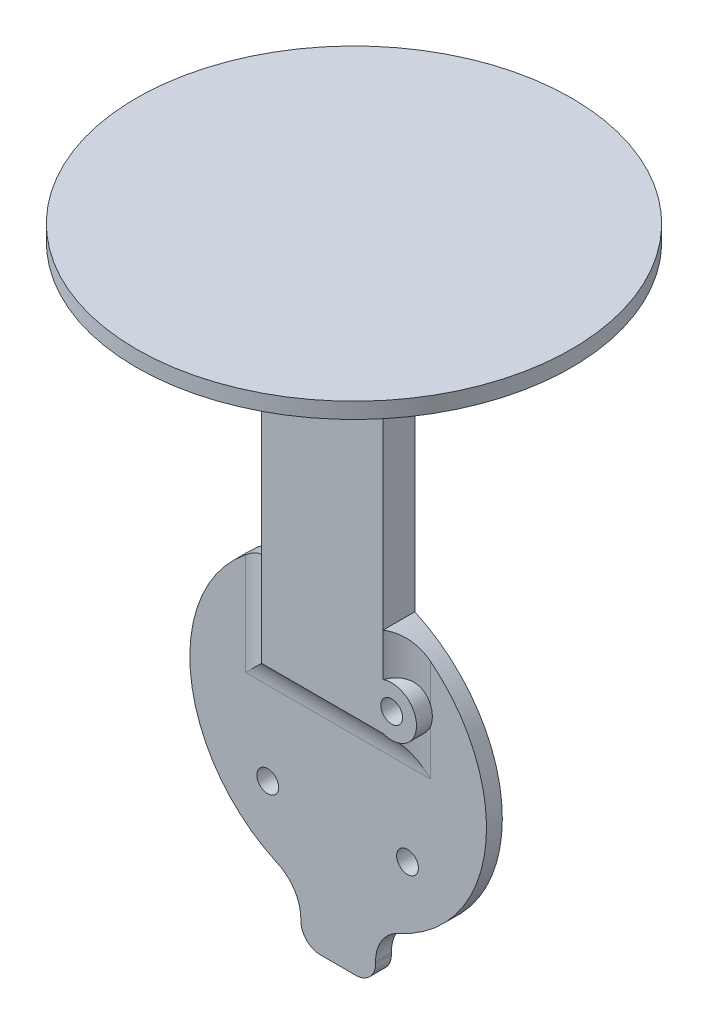
ISO-10303-21;
HEADER;
FILE_DESCRIPTION(('STEP AP214'),'2;1');
FILE_NAME('part.step','',(''),(''),'','','');
FILE_SCHEMA(('AUTOMOTIVE_DESIGN { 1 0 10303 214 1 1 1 1 }'));
ENDSEC;
DATA;
#1=APPLICATION_CONTEXT('core data for automotive mechanical design processes');
#2=APPLICATION_PROTOCOL_DEFINITION('international standard','automotive_design',2000,#1);
#3=PRODUCT_CONTEXT('',#1,'mechanical');
#4=PRODUCT('Part','Part','',(#3));
#5=PRODUCT_RELATED_PRODUCT_CATEGORY('part','',(#4));
#6=PRODUCT_DEFINITION_FORMATION('','',#4);
#7=PRODUCT_DEFINITION_CONTEXT('part definition',#1,'design');
#8=PRODUCT_DEFINITION('design','',#6,#7);
#9=PRODUCT_DEFINITION_SHAPE('','',#8);
#10=(LENGTH_UNIT() NAMED_UNIT(*) SI_UNIT(.MILLI.,.METRE.));
#11=(NAMED_UNIT(*) PLANE_ANGLE_UNIT() SI_UNIT($,.RADIAN.));
#12=(NAMED_UNIT(*) SI_UNIT($,.STERADIAN.) SOLID_ANGLE_UNIT());
#13=UNCERTAINTY_MEASURE_WITH_UNIT(LENGTH_MEASURE(1.E-05),#10,'distance_accuracy_value','');
#14=(GEOMETRIC_REPRESENTATION_CONTEXT(3) GLOBAL_UNCERTAINTY_ASSIGNED_CONTEXT((#13)) GLOBAL_UNIT_ASSIGNED_CONTEXT((#10,
#11,#12)) REPRESENTATION_CONTEXT('',''));
#15=CARTESIAN_POINT('',(0.,0.,0.));
#16=DIRECTION('',(0.,0.,1.));
#17=DIRECTION('',(1.,0.,0.));
#18=AXIS2_PLACEMENT_3D('',#15,#16,#17);
#19=CARTESIAN_POINT('',(23.3729234585394,0.,14.));
#20=DIRECTION('',(0.,-1.,0.));
#21=DIRECTION('',(0.,0.,-1.));
#22=AXIS2_PLACEMENT_3D('',#19,#20,#21);
#23=CYLINDRICAL_SURFACE('',#22,10.);
#24=DIRECTION('',(0.,1.,0.));
#25=VECTOR('',#24,1.);
#26=CARTESIAN_POINT('',(23.3729234585394,11.5489945248726,4.));
#27=LINE('',#26,#25);
#28=CARTESIAN_POINT('',(23.3729234585394,15.1527230278606,4.));
#29=VERTEX_POINT('',#28);
#30=CARTESIAN_POINT('',(23.3729234585394,3.54899452487256,4.));
#31=VERTEX_POINT('',#30);
#32=EDGE_CURVE('E309',#29,#31,#27,.F.);
#33=ORIENTED_EDGE('',*,*,#32,.F.);
#34=CARTESIAN_POINT('',(23.3729234585394,15.1527230278606,4.));
#35=CARTESIAN_POINT('',(23.3107058353815,14.9944832102016,4.0000171971293));
#36=CARTESIAN_POINT('',(23.2420297891066,14.838776109017,4.00058085847616));
#37=CARTESIAN_POINT('',(23.0922870577029,14.5334232482931,4.00365351216868));
#38=CARTESIAN_POINT('',(23.0112180321708,14.383778640417,4.00616287232315));
#39=CARTESIAN_POINT('',(22.837058359816,14.0913031156705,4.0139881026005));
#40=CARTESIAN_POINT('',(22.7439430333689,13.9484870348589,4.01930980548334));
#41=CARTESIAN_POINT('',(22.5465224712002,13.6710205619217,4.03371385845618));
#42=CARTESIAN_POINT('',(22.4422180850126,13.5363695510729,4.04279592318861));
#43=CARTESIAN_POINT('',(22.2229809493684,13.2758941131293,4.06572589078448));
#44=CARTESIAN_POINT('',(22.1080236648196,13.1500912976155,4.07958500586074));
#45=CARTESIAN_POINT('',(21.868697746027,12.9086114587839,4.1130440444213));
#46=CARTESIAN_POINT('',(21.7443297107075,12.7929337920848,4.13264360279669));
#47=CARTESIAN_POINT('',(21.4875630137949,12.5727337178929,4.178473087253));
#48=CARTESIAN_POINT('',(21.3551774830273,12.4681938049053,4.20469238360318));
#49=CARTESIAN_POINT('',(21.0835613629784,12.2707995648025,4.26459283000614));
#50=CARTESIAN_POINT('',(20.9443312013659,12.1779445088765,4.29827351431332));
#51=CARTESIAN_POINT('',(20.667372211933,12.0086499256712,4.37194065390758));
#52=CARTESIAN_POINT('',(20.5298928652722,11.9316359120001,4.41154622207339));
#53=CARTESIAN_POINT('',(20.2515256920797,11.7890014771629,4.49851940552375));
#54=CARTESIAN_POINT('',(20.1106379845212,11.7233806589546,4.54588675020577));
#55=CARTESIAN_POINT('',(19.826888736259,11.6036110898744,4.64861468940038));
#56=CARTESIAN_POINT('',(19.6840268682777,11.5494642660739,4.70397662399288));
#57=CARTESIAN_POINT('',(19.3977947349352,11.4525226898111,4.82272599874594));
#58=CARTESIAN_POINT('',(19.2544244667641,11.4097280001893,4.88611348332962));
#59=CARTESIAN_POINT('',(18.9721485190243,11.336083295285,5.01908098175488));
#60=CARTESIAN_POINT('',(18.8332213844119,11.3049594266825,5.08846466738074));
#61=CARTESIAN_POINT('',(18.5573323722278,11.2526717992391,5.23447421143388));
#62=CARTESIAN_POINT('',(18.4203704226444,11.2315076745274,5.31109980370592));
#63=CARTESIAN_POINT('',(18.1493225117156,11.1984959197321,5.47129611998773));
#64=CARTESIAN_POINT('',(18.0152382640591,11.1866536989241,5.55487084536156));
#65=CARTESIAN_POINT('',(17.7508401770822,11.1715704253522,5.72853009197163));
#66=CARTESIAN_POINT('',(17.6205271792895,11.1683312778871,5.81861605069569));
#67=CARTESIAN_POINT('',(17.3138808499514,11.16993069396,6.04156413146732));
#68=CARTESIAN_POINT('',(17.1396416310285,11.178454117998,6.17729704335375));
#69=CARTESIAN_POINT('',(16.8011493508352,11.2084515012195,6.45941741809575));
#70=CARTESIAN_POINT('',(16.6369008658023,11.2299313466205,6.60580969700116));
#71=CARTESIAN_POINT('',(16.319375081528,11.2835906842312,6.90806823844672));
#72=CARTESIAN_POINT('',(16.1660946363732,11.3157670933234,7.06393176048204));
#73=CARTESIAN_POINT('',(15.8709825204191,11.3886519071205,7.38423839484402));
#74=CARTESIAN_POINT('',(15.7291500869565,11.4293597428133,7.54868093443529));
#75=CARTESIAN_POINT('',(15.5555766279759,11.4854412405891,7.76360019995112));
#76=CARTESIAN_POINT('',(15.518376562238,11.4978533598747,7.8105190765067));
#77=CARTESIAN_POINT('',(15.4449429538109,11.5231076312555,7.9048633530736));
#78=CARTESIAN_POINT('',(15.408707916786,11.53594903953,7.95228778891833));
#79=CARTESIAN_POINT('',(15.3729234585394,11.5489945248726,8.));
#80=B_SPLINE_CURVE_WITH_KNOTS('',3,(#34,#35,#36,#37,#38,#39,#40,#41,#42,#43,#44,#45,#46,#47,#48,
#49,#50,#51,#52,#53,#54,#55,#56,#57,#58,#59,#60,#61,#62,#63,#64,#65,#66,#67,#68,#69,#70,#71,#72,
#73,#74,#75,#76,#77,#78,#79),.UNSPECIFIED.,.F.,.F.,(4,2,2,2,2,2,2,2,2,2,2,2,2,2,2,2,2,2,2,2,2,2,
4),(0.,0.509965390646504,1.02002720705955,1.53115106039005,2.04223613385315,2.55452903655667,
3.06678936301263,3.57823229499398,4.08964331130264,4.57647391267023,5.06328754503853,
5.55018287366189,6.03708089747125,6.5117079038317,6.98631747343412,7.46120224490697,
7.9361921790282,8.59830178671491,9.26071242348631,9.92293229602897,10.5851080151914,
10.7685507538082,10.9516906271199),.UNSPECIFIED.);
#81=CARTESIAN_POINT('',(15.3729234585394,11.5489945248726,8.));
#82=VERTEX_POINT('',#81);
#83=EDGE_CURVE('E246',#29,#82,#80,.T.);
#84=ORIENTED_EDGE('',*,*,#83,.T.);
#85=CARTESIAN_POINT('',(23.3729234585394,3.54899452487256,14.));
#86=DIRECTION('',(-0.707106781186547,-0.707106781186547,0.));
#87=DIRECTION('',(0.707106781186547,-0.707106781186547,0.));
#88=AXIS2_PLACEMENT_3D('',#85,#86,#87);
#89=ELLIPSE('',#88,14.1421356237309,10.);
#90=EDGE_CURVE('E185',#31,#82,#89,.F.);
#91=ORIENTED_EDGE('',*,*,#90,.F.);
#92=EDGE_LOOP('',(#33,#84,#91));
#93=FACE_BOUND('',#92,.T.);
#94=ADVANCED_FACE('F35',(#93),#23,.F.);
#95=CARTESIAN_POINT('',(0.,0.,4.));
#96=DIRECTION('',(0.,0.,-1.));
#97=DIRECTION('',(-1.,0.,0.));
#98=AXIS2_PLACEMENT_3D('',#95,#96,#97);
#99=CYLINDRICAL_SURFACE('',#98,37.5);
#100=DIRECTION('',(0.,0.,-1.));
#101=VECTOR('',#100,1.);
#102=CARTESIAN_POINT('',(-15.3729234104389,34.2041404776787,4.));
#103=LINE('',#102,#101);
#104=CARTESIAN_POINT('',(-15.3729234104389,34.2041404776787,0.));
#105=VERTEX_POINT('',#104);
#106=CARTESIAN_POINT('',(-15.3729234104389,34.2041404776787,8.));
#107=VERTEX_POINT('',#106);
#108=EDGE_CURVE('E260',#105,#107,#103,.F.);
#109=ORIENTED_EDGE('',*,*,#108,.F.);
#110=CARTESIAN_POINT('',(0.,0.,0.));
#111=DIRECTION('',(0.,0.,1.));
#112=DIRECTION('',(1.,0.,0.));
#113=AXIS2_PLACEMENT_3D('',#110,#111,#112);
#114=CIRCLE('',#113,37.5);
#115=CARTESIAN_POINT('',(-15.3539075144878,-34.2126807490521,0.));
#116=VERTEX_POINT('',#115);
#117=EDGE_CURVE('E290',#105,#116,#114,.T.);
#118=ORIENTED_EDGE('',*,*,#117,.T.);
#119=DIRECTION('',(0.,0.,-1.));
#120=VECTOR('',#119,1.);
#121=CARTESIAN_POINT('',(-15.3539075144878,-34.2126807490521,4.));
#122=LINE('',#121,#120);
#123=CARTESIAN_POINT('',(-15.3539075144878,-34.2126807490521,4.));
#124=VERTEX_POINT('',#123);
#125=EDGE_CURVE('E287',#124,#116,#122,.T.);
#126=ORIENTED_EDGE('',*,*,#125,.F.);
#127=CARTESIAN_POINT('',(0.,0.,4.));
#128=DIRECTION('',(0.,0.,1.));
#129=DIRECTION('',(1.,0.,0.));
#130=AXIS2_PLACEMENT_3D('',#127,#128,#129);
#131=CIRCLE('',#130,37.5);
#132=CARTESIAN_POINT('',(-23.372923410439,29.3250140878015,4.));
#133=VERTEX_POINT('',#132);
#134=EDGE_CURVE('E269',#133,#124,#131,.T.);
#135=ORIENTED_EDGE('',*,*,#134,.F.);
#136=CARTESIAN_POINT('',(-23.372923410439,29.3250140878015,4.));
#137=CARTESIAN_POINT('',(-23.206756572799,29.4574565894703,4.00000360733753));
#138=CARTESIAN_POINT('',(-23.0394766195653,29.588470609309,4.00414268753807));
#139=CARTESIAN_POINT('',(-22.7029585506461,29.8474581265888,4.02104404491556));
#140=CARTESIAN_POINT('',(-22.5337200455817,29.9754310034255,4.03380806679913));
#141=CARTESIAN_POINT('',(-22.0229244834639,30.3549128940837,4.08562928126293));
#142=CARTESIAN_POINT('',(-21.6789211799209,30.601480199833,4.1382183456445));
#143=CARTESIAN_POINT('',(-20.9863371103034,31.0805734435921,4.28248642621714));
#144=CARTESIAN_POINT('',(-20.6377414438373,31.3130117025232,4.37438570642131));
#145=CARTESIAN_POINT('',(-19.9428625427741,31.7600774935846,4.59958524794114));
#146=CARTESIAN_POINT('',(-19.5965771820225,31.9747243842017,4.73283974168938));
#147=CARTESIAN_POINT('',(-19.0160022510376,32.3221125005758,4.99524299988847));
#148=CARTESIAN_POINT('',(-18.7796812212403,32.4599098527093,5.11331495166636));
#149=CARTESIAN_POINT('',(-18.3129065962514,32.7255174220744,5.3705613158434));
#150=CARTESIAN_POINT('',(-18.0824532507433,32.8533272147894,5.50973662449262));
#151=CARTESIAN_POINT('',(-17.6309021382344,33.0978384174085,5.80841291848245));
#152=CARTESIAN_POINT('',(-17.4097634926514,33.214591981694,5.96780922070511));
#153=CARTESIAN_POINT('',(-16.9781139746448,33.4372938378372,6.30703280045193));
#154=CARTESIAN_POINT('',(-16.767599129888,33.5432461837101,6.48685235855469));
#155=CARTESIAN_POINT('',(-16.3492000136471,33.7492329247755,6.87589206009206));
#156=CARTESIAN_POINT('',(-16.1419832879704,33.8486997637906,7.08613732822127));
#157=CARTESIAN_POINT('',(-15.8437690636665,33.9887792746086,7.41714313541205));
#158=CARTESIAN_POINT('',(-15.7463403690449,34.0340084359356,7.53025174459107));
#159=CARTESIAN_POINT('',(-15.5560957920925,34.1213837966633,7.76144124013293));
#160=CARTESIAN_POINT('',(-15.4632801716761,34.1635298210779,7.879522408119));
#161=CARTESIAN_POINT('',(-15.372923410439,34.2041404776787,8.));
#162=B_SPLINE_CURVE_WITH_KNOTS('',3,(#136,#137,#138,#139,#140,#141,#142,#143,#144,#145,#146,
#147,#148,#149,#150,#151,#152,#153,#154,#155,#156,#157,#158,#159,#160,#161),.UNSPECIFIED.,.F.,
.F.,(4,2,2,2,2,2,2,2,2,2,2,2,4),(0.,0.637377325187555,1.27488362162096,2.55231856514755,
3.83700700734766,5.12027873217346,6.01326725716798,6.90629371761066,7.79487250958649,
8.68311655429293,9.61613642278262,10.0839399292971,10.5517699658109),.UNSPECIFIED.);
#163=EDGE_CURVE('E332',#133,#107,#162,.T.);
#164=ORIENTED_EDGE('',*,*,#163,.T.);
#165=EDGE_LOOP('',(#109,#118,#126,#135,#164));
#166=FACE_BOUND('',#165,.T.);
#167=ADVANCED_FACE('F439',(#166),#99,.T.);
#168=CARTESIAN_POINT('',(-19.4482828516845,-43.3360622821326,4.));
#169=DIRECTION('',(0.,0.,-1.));
#170=DIRECTION('',(-1.,0.,0.));
#171=AXIS2_PLACEMENT_3D('',#168,#169,#170);
#172=CYLINDRICAL_SURFACE('',#171,10.);
#173=CARTESIAN_POINT('',(-19.4482828516845,-43.3360622821326,0.));
#174=DIRECTION('',(0.,0.,1.));
#175=DIRECTION('',(1.,0.,0.));
#176=AXIS2_PLACEMENT_3D('',#173,#174,#175);
#177=CIRCLE('',#176,10.);
#178=CARTESIAN_POINT('',(-9.44828285168446,-43.3360622821325,0.));
#179=VERTEX_POINT('',#178);
#180=EDGE_CURVE('E265',#179,#116,#177,.T.);
#181=ORIENTED_EDGE('',*,*,#180,.F.);
#182=DIRECTION('',(0.,0.,-1.));
#183=VECTOR('',#182,1.);
#184=CARTESIAN_POINT('',(-9.44828285168446,-43.3360622821325,4.));
#185=LINE('',#184,#183);
#186=CARTESIAN_POINT('',(-9.44828285168446,-43.3360622821325,4.));
#187=VERTEX_POINT('',#186);
#188=EDGE_CURVE('E307',#187,#179,#185,.T.);
#189=ORIENTED_EDGE('',*,*,#188,.F.);
#190=CARTESIAN_POINT('',(-19.4482828516845,-43.3360622821326,4.));
#191=DIRECTION('',(0.,0.,1.));
#192=DIRECTION('',(1.,0.,0.));
#193=AXIS2_PLACEMENT_3D('',#190,#191,#192);
#194=CIRCLE('',#193,10.);
#195=EDGE_CURVE('E266',#187,#124,#194,.T.);
#196=ORIENTED_EDGE('',*,*,#195,.T.);
#197=ORIENTED_EDGE('',*,*,#125,.T.);
#198=EDGE_LOOP('',(#181,#189,#196,#197));
#199=FACE_BOUND('',#198,.T.);
#200=ADVANCED_FACE('F346',(#199),#172,.F.);
#201=CARTESIAN_POINT('',(-9.44828285168446,-43.3360622821325,4.));
#202=DIRECTION('',(1.,0.,0.));
#203=DIRECTION('',(0.,1.,0.));
#204=AXIS2_PLACEMENT_3D('',#201,#202,#203);
#205=PLANE('',#204);
#206=DIRECTION('',(0.,-1.,0.));
#207=VECTOR('',#206,1.);
#208=CARTESIAN_POINT('',(-9.44828285168446,-43.3360622821325,0.));
#209=LINE('',#208,#207);
#210=CARTESIAN_POINT('',(-9.44828285168444,-43.8420834907348,0.));
#211=VERTEX_POINT('',#210);
#212=EDGE_CURVE('E270',#179,#211,#209,.T.);
#213=ORIENTED_EDGE('',*,*,#212,.T.);
#214=DIRECTION('',(0.,0.,-1.));
#215=VECTOR('',#214,1.);
#216=CARTESIAN_POINT('',(-9.44828285168444,-43.8420834907348,4.));
#217=LINE('',#216,#215);
#218=CARTESIAN_POINT('',(-9.44828285168444,-43.8420834907348,4.));
#219=VERTEX_POINT('',#218);
#220=EDGE_CURVE('E310',#219,#211,#217,.T.);
#221=ORIENTED_EDGE('',*,*,#220,.F.);
#222=DIRECTION('',(0.,-1.,0.));
#223=VECTOR('',#222,1.);
#224=CARTESIAN_POINT('',(-9.44828285168446,-43.3360622821325,4.));
#225=LINE('',#224,#223);
#226=EDGE_CURVE('E285',#187,#219,#225,.T.);
#227=ORIENTED_EDGE('',*,*,#226,.F.);
#228=ORIENTED_EDGE('',*,*,#188,.T.);
#229=EDGE_LOOP('',(#213,#221,#227,#228));
#230=FACE_BOUND('',#229,.T.);
#231=ADVANCED_FACE('F413',(#230),#205,.F.);
#232=CARTESIAN_POINT('',(-4.44828285168445,-43.8420834907347,4.));
#233=DIRECTION('',(0.,0.,-1.));
#234=DIRECTION('',(-1.,0.,0.));
#235=AXIS2_PLACEMENT_3D('',#232,#233,#234);
#236=CYLINDRICAL_SURFACE('',#235,5.);
#237=CARTESIAN_POINT('',(-4.44828285168445,-43.8420834907347,0.));
#238=DIRECTION('',(0.,0.,1.));
#239=DIRECTION('',(1.,0.,0.));
#240=AXIS2_PLACEMENT_3D('',#237,#238,#239);
#241=CIRCLE('',#240,5.);
#242=CARTESIAN_POINT('',(-4.44828285168443,-48.8420834907347,0.));
#243=VERTEX_POINT('',#242);
#244=EDGE_CURVE('E304',#211,#243,#241,.T.);
#245=ORIENTED_EDGE('',*,*,#244,.T.);
#246=DIRECTION('',(0.,0.,-1.));
#247=VECTOR('',#246,1.);
#248=CARTESIAN_POINT('',(-4.44828285168443,-48.8420834907347,4.));
#249=LINE('',#248,#247);
#250=CARTESIAN_POINT('',(-4.44828285168443,-48.8420834907347,4.));
#251=VERTEX_POINT('',#250);
#252=EDGE_CURVE('E313',#251,#243,#249,.T.);
#253=ORIENTED_EDGE('',*,*,#252,.F.);
#254=CARTESIAN_POINT('',(-4.44828285168445,-43.8420834907347,4.));
#255=DIRECTION('',(0.,0.,1.));
#256=DIRECTION('',(1.,0.,0.));
#257=AXIS2_PLACEMENT_3D('',#254,#255,#256);
#258=CIRCLE('',#257,5.);
#259=EDGE_CURVE('E283',#219,#251,#258,.T.);
#260=ORIENTED_EDGE('',*,*,#259,.F.);
#261=ORIENTED_EDGE('',*,*,#220,.T.);
#262=EDGE_LOOP('',(#245,#253,#260,#261));
#263=FACE_BOUND('',#262,.T.);
#264=ADVANCED_FACE('F416',(#263),#236,.T.);
#265=CARTESIAN_POINT('',(-4.44828285168443,-48.8420834907347,4.));
#266=DIRECTION('',(0.,1.,0.));
#267=DIRECTION('',(-1.,0.,0.));
#268=AXIS2_PLACEMENT_3D('',#265,#266,#267);
#269=PLANE('',#268);
#270=DIRECTION('',(1.,0.,0.));
#271=VECTOR('',#270,1.);
#272=CARTESIAN_POINT('',(-4.44828285168443,-48.8420834907347,0.));
#273=LINE('',#272,#271);
#274=CARTESIAN_POINT('',(4.44828279609825,-48.8420834907347,0.));
#275=VERTEX_POINT('',#274);
#276=EDGE_CURVE('E302',#243,#275,#273,.T.);
#277=ORIENTED_EDGE('',*,*,#276,.T.);
#278=DIRECTION('',(0.,0.,-1.));
#279=VECTOR('',#278,1.);
#280=CARTESIAN_POINT('',(4.44828279609825,-48.8420834907347,4.));
#281=LINE('',#280,#279);
#282=CARTESIAN_POINT('',(4.44828279609825,-48.8420834907347,4.));
#283=VERTEX_POINT('',#282);
#284=EDGE_CURVE('E316',#283,#275,#281,.T.);
#285=ORIENTED_EDGE('',*,*,#284,.F.);
#286=DIRECTION('',(1.,0.,0.));
#287=VECTOR('',#286,1.);
#288=CARTESIAN_POINT('',(-4.44828285168443,-48.8420834907347,4.));
#289=LINE('',#288,#287);
#290=EDGE_CURVE('E281',#251,#283,#289,.T.);
#291=ORIENTED_EDGE('',*,*,#290,.F.);
#292=ORIENTED_EDGE('',*,*,#252,.T.);
#293=EDGE_LOOP('',(#277,#285,#291,#292));
#294=FACE_BOUND('',#293,.T.);
#295=ADVANCED_FACE('F420',(#294),#269,.F.);
#296=CARTESIAN_POINT('',(4.44828279609824,-43.8420834907347,4.));
#297=DIRECTION('',(0.,0.,-1.));
#298=DIRECTION('',(-1.,0.,0.));
#299=AXIS2_PLACEMENT_3D('',#296,#297,#298);
#300=CYLINDRICAL_SURFACE('',#299,5.);
#301=CARTESIAN_POINT('',(4.44828279609824,-43.8420834907347,0.));
#302=DIRECTION('',(0.,0.,1.));
#303=DIRECTION('',(1.,0.,0.));
#304=AXIS2_PLACEMENT_3D('',#301,#302,#303);
#305=CIRCLE('',#304,5.);
#306=CARTESIAN_POINT('',(9.44828279609824,-43.8420834907347,0.));
#307=VERTEX_POINT('',#306);
#308=EDGE_CURVE('E300',#275,#307,#305,.T.);
#309=ORIENTED_EDGE('',*,*,#308,.T.);
#310=DIRECTION('',(0.,0.,-1.));
#311=VECTOR('',#310,1.);
#312=CARTESIAN_POINT('',(9.44828279609824,-43.8420834907347,4.));
#313=LINE('',#312,#311);
#314=CARTESIAN_POINT('',(9.44828279609824,-43.8420834907347,4.));
#315=VERTEX_POINT('',#314);
#316=EDGE_CURVE('E319',#315,#307,#313,.T.);
#317=ORIENTED_EDGE('',*,*,#316,.F.);
#318=CARTESIAN_POINT('',(4.44828279609824,-43.8420834907347,4.));
#319=DIRECTION('',(0.,0.,1.));
#320=DIRECTION('',(1.,0.,0.));
#321=AXIS2_PLACEMENT_3D('',#318,#319,#320);
#322=CIRCLE('',#321,5.);
#323=EDGE_CURVE('E279',#283,#315,#322,.T.);
#324=ORIENTED_EDGE('',*,*,#323,.F.);
#325=ORIENTED_EDGE('',*,*,#284,.T.);
#326=EDGE_LOOP('',(#309,#317,#324,#325));
#327=FACE_BOUND('',#326,.T.);
#328=ADVANCED_FACE('F424',(#327),#300,.T.);
#329=CARTESIAN_POINT('',(9.44828279609824,-43.8420834907347,4.));
#330=DIRECTION('',(-1.,0.,0.));
#331=DIRECTION('',(0.,-1.,0.));
#332=AXIS2_PLACEMENT_3D('',#329,#330,#331);
#333=PLANE('',#332);
#334=DIRECTION('',(0.,1.,0.));
#335=VECTOR('',#334,1.);
#336=CARTESIAN_POINT('',(9.44828279609824,-43.8420834907347,0.));
#337=LINE('',#336,#335);
#338=CARTESIAN_POINT('',(9.44828279609824,-43.3360623070785,0.));
#339=VERTEX_POINT('',#338);
#340=EDGE_CURVE('E297',#307,#339,#337,.T.);
#341=ORIENTED_EDGE('',*,*,#340,.T.);
#342=DIRECTION('',(0.,0.,-1.));
#343=VECTOR('',#342,1.);
#344=CARTESIAN_POINT('',(9.44828279609824,-43.3360623070785,4.));
#345=LINE('',#344,#343);
#346=CARTESIAN_POINT('',(9.44828279609824,-43.3360623070785,4.));
#347=VERTEX_POINT('',#346);
#348=EDGE_CURVE('E322',#347,#339,#345,.T.);
#349=ORIENTED_EDGE('',*,*,#348,.F.);
#350=DIRECTION('',(0.,1.,0.));
#351=VECTOR('',#350,1.);
#352=CARTESIAN_POINT('',(9.44828279609824,-43.8420834907347,4.));
#353=LINE('',#352,#351);
#354=EDGE_CURVE('E277',#315,#347,#353,.T.);
#355=ORIENTED_EDGE('',*,*,#354,.F.);
#356=ORIENTED_EDGE('',*,*,#316,.T.);
#357=EDGE_LOOP('',(#341,#349,#355,#356));
#358=FACE_BOUND('',#357,.T.);
#359=ADVANCED_FACE('F428',(#358),#333,.F.);
#360=CARTESIAN_POINT('',(19.4482827960982,-43.3360623070785,4.));
#361=DIRECTION('',(0.,0.,-1.));
#362=DIRECTION('',(-1.,0.,0.));
#363=AXIS2_PLACEMENT_3D('',#360,#361,#362);
#364=CYLINDRICAL_SURFACE('',#363,10.);
#365=CARTESIAN_POINT('',(19.4482827960982,-43.3360623070785,0.));
#366=DIRECTION('',(0.,0.,1.));
#367=DIRECTION('',(1.,0.,0.));
#368=AXIS2_PLACEMENT_3D('',#365,#366,#367);
#369=CIRCLE('',#368,10.);
#370=CARTESIAN_POINT('',(15.3539074706039,-34.2126807687462,0.));
#371=VERTEX_POINT('',#370);
#372=EDGE_CURVE('E294',#371,#339,#369,.T.);
#373=ORIENTED_EDGE('',*,*,#372,.F.);
#374=DIRECTION('',(0.,0.,-1.));
#375=VECTOR('',#374,1.);
#376=CARTESIAN_POINT('',(15.3539074706039,-34.2126807687462,4.));
#377=LINE('',#376,#375);
#378=CARTESIAN_POINT('',(15.3539074706039,-34.2126807687462,4.));
#379=VERTEX_POINT('',#378);
#380=EDGE_CURVE('E324',#379,#371,#377,.T.);
#381=ORIENTED_EDGE('',*,*,#380,.F.);
#382=CARTESIAN_POINT('',(19.4482827960982,-43.3360623070785,4.));
#383=DIRECTION('',(0.,0.,1.));
#384=DIRECTION('',(1.,0.,0.));
#385=AXIS2_PLACEMENT_3D('',#382,#383,#384);
#386=CIRCLE('',#385,10.);
#387=EDGE_CURVE('E274',#379,#347,#386,.T.);
#388=ORIENTED_EDGE('',*,*,#387,.T.);
#389=ORIENTED_EDGE('',*,*,#348,.T.);
#390=EDGE_LOOP('',(#373,#381,#388,#389));
#391=FACE_BOUND('',#390,.T.);
#392=ADVANCED_FACE('F431',(#391),#364,.F.);
#393=CARTESIAN_POINT('',(15.3729234585394,34.2041404560602,0.));
#394=VERTEX_POINT('',#393);
#395=EDGE_CURVE('E291',#371,#394,#114,.T.);
#396=ORIENTED_EDGE('',*,*,#395,.T.);
#397=DIRECTION('',(0.,0.,-1.));
#398=VECTOR('',#397,1.);
#399=CARTESIAN_POINT('',(15.3729234585394,34.2041404560602,4.));
#400=LINE('',#399,#398);
#401=CARTESIAN_POINT('',(15.3729234585394,34.2041404560602,8.));
#402=VERTEX_POINT('',#401);
#403=EDGE_CURVE('E262',#394,#402,#400,.F.);
#404=ORIENTED_EDGE('',*,*,#403,.T.);
#405=CARTESIAN_POINT('',(15.3729234585394,34.2041404560602,8.));
#406=CARTESIAN_POINT('',(15.4578742537936,34.1659595376349,7.88673067860072));
#407=CARTESIAN_POINT('',(15.5449994301259,34.1264210189988,7.77557799237571));
#408=CARTESIAN_POINT('',(15.7233437648702,34.0446191215209,7.55765925888418));
#409=CARTESIAN_POINT('',(15.8145626363492,34.0023559335649,7.45089290517489));
#410=CARTESIAN_POINT('',(16.0938501806422,33.871524884313,7.13754360961775));
#411=CARTESIAN_POINT('',(16.2876835431458,33.778855807159,6.9377326784401));
#412=CARTESIAN_POINT('',(16.6866507618241,33.583546766166,6.55897649212146));
#413=CARTESIAN_POINT('',(16.8916782867145,33.4809952975905,6.37987280455147));
#414=CARTESIAN_POINT('',(17.3122345685444,33.2654828523522,6.04129893424401));
#415=CARTESIAN_POINT('',(17.5277643215902,33.1525208873745,5.88183061894435));
#416=CARTESIAN_POINT('',(17.9666295943194,32.9167458011215,5.58321230370693));
#417=CARTESIAN_POINT('',(18.189950299818,32.7939508561953,5.44402609684489));
#418=CARTESIAN_POINT('',(18.6426156981236,32.5387521493581,5.18568716337935));
#419=CARTESIAN_POINT('',(18.8719609468498,32.4063474987028,5.06653629311277));
#420=CARTESIAN_POINT('',(19.335392621673,32.1319987312036,4.84771981539241));
#421=CARTESIAN_POINT('',(19.5694923176144,31.9900242490233,4.74812057239422));
#422=CARTESIAN_POINT('',(20.0398030397342,31.6975233666151,4.56847417494285));
#423=CARTESIAN_POINT('',(20.276014010479,31.5469971903678,4.48842650869797));
#424=CARTESIAN_POINT('',(20.7543207832584,31.2344624022313,4.34564138298427));
#425=CARTESIAN_POINT('',(20.9964270132834,31.072269352404,4.28334426658108));
#426=CARTESIAN_POINT('',(21.4795885964913,30.7402544428023,4.17775759112907));
#427=CARTESIAN_POINT('',(21.7206437585384,30.5704312541682,4.13447135725735));
#428=CARTESIAN_POINT('',(22.1990660189855,30.2247913900221,4.06621172594797));
#429=CARTESIAN_POINT('',(22.4364458144766,30.0490107194347,4.04114370458759));
#430=CARTESIAN_POINT('',(22.9076084746185,29.69140056327,4.0080423398997));
#431=CARTESIAN_POINT('',(23.1413933272219,29.5095746104959,3.99999921912386));
#432=CARTESIAN_POINT('',(23.3729234585394,29.325014049464,4.));
#433=B_SPLINE_CURVE_WITH_KNOTS('',3,(#405,#406,#407,#408,#409,#410,#411,#412,#413,#414,#415,
#416,#417,#418,#419,#420,#421,#422,#423,#424,#425,#426,#427,#428,#429,#430,#431,#432),
.UNSPECIFIED.,.F.,.F.,(4,2,2,2,2,2,2,2,2,2,2,2,2,4),(0.,0.439851155450941,0.879671529100979,
1.75862376096704,2.63033012807117,3.5021193355769,4.37233267098699,5.24262659002352,
6.11582533732679,6.98900122489999,7.88225446317416,8.77566387744128,9.66439917013261,
10.5526239210072),.UNSPECIFIED.);
#434=CARTESIAN_POINT('',(23.3729234585394,29.325014049464,4.));
#435=VERTEX_POINT('',#434);
#436=EDGE_CURVE('E199',#402,#435,#433,.T.);
#437=ORIENTED_EDGE('',*,*,#436,.T.);
#438=EDGE_CURVE('E271',#379,#435,#131,.T.);
#439=ORIENTED_EDGE('',*,*,#438,.F.);
#440=ORIENTED_EDGE('',*,*,#380,.T.);
#441=EDGE_LOOP('',(#396,#404,#437,#439,#440));
#442=FACE_BOUND('',#441,.T.);
#443=ADVANCED_FACE('F338',(#442),#99,.T.);
#444=CARTESIAN_POINT('',(-19.4482828516845,-43.3360622821326,4.));
#445=DIRECTION('',(0.,0.,1.));
#446=DIRECTION('',(1.,0.,0.));
#447=AXIS2_PLACEMENT_3D('',#444,#445,#446);
#448=PLANE('',#447);
#449=CARTESIAN_POINT('',(17.5251841305067,17.4526979165807,4.));
#450=DIRECTION('',(0.,0.,1.));
#451=DIRECTION('',(1.,0.,0.));
#452=AXIS2_PLACEMENT_3D('',#449,#450,#451);
#453=CIRCLE('',#452,6.28378387099389);
#454=CARTESIAN_POINT('',(23.3729234585394,19.7526728053007,4.));
#455=VERTEX_POINT('',#454);
#456=EDGE_CURVE('E52',#455,#29,#453,.F.);
#457=ORIENTED_EDGE('',*,*,#456,.T.);
#458=ORIENTED_EDGE('',*,*,#32,.T.);
#459=DIRECTION('',(-1.,0.,0.));
#460=VECTOR('',#459,1.);
#461=CARTESIAN_POINT('',(-15.372923410439,3.54899452487256,4.));
#462=LINE('',#461,#460);
#463=CARTESIAN_POINT('',(-23.372923410439,3.54899452487256,4.));
#464=VERTEX_POINT('',#463);
#465=EDGE_CURVE('E330',#31,#464,#462,.T.);
#466=ORIENTED_EDGE('',*,*,#465,.T.);
#467=DIRECTION('',(0.,1.,0.));
#468=VECTOR('',#467,1.);
#469=CARTESIAN_POINT('',(-23.372923410439,34.2041404776787,4.));
#470=LINE('',#469,#468);
#471=EDGE_CURVE('E191',#464,#133,#470,.T.);
#472=ORIENTED_EDGE('',*,*,#471,.T.);
#473=ORIENTED_EDGE('',*,*,#134,.T.);
#474=ORIENTED_EDGE('',*,*,#195,.F.);
#475=ORIENTED_EDGE('',*,*,#226,.T.);
#476=ORIENTED_EDGE('',*,*,#259,.T.);
#477=ORIENTED_EDGE('',*,*,#290,.T.);
#478=ORIENTED_EDGE('',*,*,#323,.T.);
#479=ORIENTED_EDGE('',*,*,#354,.T.);
#480=ORIENTED_EDGE('',*,*,#387,.F.);
#481=ORIENTED_EDGE('',*,*,#438,.T.);
#482=EDGE_CURVE('E328',#435,#455,#27,.F.);
#483=ORIENTED_EDGE('',*,*,#482,.T.);
#484=EDGE_LOOP('',(#457,#458,#466,#472,#473,#474,#475,#476,#477,#478,#479,#480,#481,#483));
#485=FACE_BOUND('',#484,.T.);
#486=CARTESIAN_POINT('',(-17.8046321219073,-17.4738839185634,4.));
#487=DIRECTION('',(0.,0.,1.));
#488=DIRECTION('',(1.,0.,0.));
#489=AXIS2_PLACEMENT_3D('',#486,#487,#488);
#490=CIRCLE('',#489,2.75);
#491=CARTESIAN_POINT('',(-15.0546321219073,-17.4738839185634,4.));
#492=VERTEX_POINT('',#491);
#493=EDGE_CURVE('E225',#492,#492,#490,.T.);
#494=ORIENTED_EDGE('',*,*,#493,.F.);
#495=EDGE_LOOP('',(#494));
#496=FACE_BOUND('',#495,.T.);
#497=CARTESIAN_POINT('',(17.5251841305067,-17.4738839185634,4.));
#498=DIRECTION('',(0.,0.,1.));
#499=DIRECTION('',(1.,0.,0.));
#500=AXIS2_PLACEMENT_3D('',#497,#498,#499);
#501=CIRCLE('',#500,2.75);
#502=CARTESIAN_POINT('',(20.2751841305067,-17.4738839185634,4.));
#503=VERTEX_POINT('',#502);
#504=EDGE_CURVE('E234',#503,#503,#501,.T.);
#505=ORIENTED_EDGE('',*,*,#504,.F.);
#506=EDGE_LOOP('',(#505));
#507=FACE_BOUND('',#506,.T.);
#508=ADVANCED_FACE('F407',(#485,#496,#507),#448,.T.);
#509=CARTESIAN_POINT('',(-19.4482828516845,-43.3360622821326,0.));
#510=DIRECTION('',(0.,0.,1.));
#511=DIRECTION('',(1.,0.,0.));
#512=AXIS2_PLACEMENT_3D('',#509,#510,#511);
#513=PLANE('',#512);
#514=CARTESIAN_POINT('',(-17.8046321219073,-17.4738839185634,0.));
#515=DIRECTION('',(0.,0.,1.));
#516=DIRECTION('',(1.,0.,0.));
#517=AXIS2_PLACEMENT_3D('',#514,#515,#516);
#518=CIRCLE('',#517,2.75);
#519=CARTESIAN_POINT('',(-15.0546321219073,-17.4738839185634,0.));
#520=VERTEX_POINT('',#519);
#521=EDGE_CURVE('E39',#520,#520,#518,.T.);
#522=ORIENTED_EDGE('',*,*,#521,.T.);
#523=EDGE_LOOP('',(#522));
#524=FACE_BOUND('',#523,.T.);
#525=CARTESIAN_POINT('',(17.5251841305067,-17.4738839185634,0.));
#526=DIRECTION('',(0.,0.,1.));
#527=DIRECTION('',(1.,0.,0.));
#528=AXIS2_PLACEMENT_3D('',#525,#526,#527);
#529=CIRCLE('',#528,2.75);
#530=CARTESIAN_POINT('',(20.2751841305067,-17.4738839185634,0.));
#531=VERTEX_POINT('',#530);
#532=EDGE_CURVE('E232',#531,#531,#529,.T.);
#533=ORIENTED_EDGE('',*,*,#532,.T.);
#534=EDGE_LOOP('',(#533));
#535=FACE_BOUND('',#534,.T.);
#536=CARTESIAN_POINT('',(17.5251841305067,17.4526979165807,0.));
#537=DIRECTION('',(0.,0.,1.));
#538=DIRECTION('',(1.,0.,0.));
#539=AXIS2_PLACEMENT_3D('',#536,#537,#538);
#540=CIRCLE('',#539,2.75);
#541=CARTESIAN_POINT('',(20.2751841305067,17.4526979165807,0.));
#542=VERTEX_POINT('',#541);
#543=EDGE_CURVE('E235',#542,#542,#540,.T.);
#544=ORIENTED_EDGE('',*,*,#543,.T.);
#545=EDGE_LOOP('',(#544));
#546=FACE_BOUND('',#545,.T.);
#547=DIRECTION('',(0.,-1.,0.));
#548=VECTOR('',#547,1.);
#549=CARTESIAN_POINT('',(-15.3729234104389,0.,0.));
#550=LINE('',#549,#548);
#551=CARTESIAN_POINT('',(-15.3729234104389,92.5,0.));
#552=VERTEX_POINT('',#551);
#553=EDGE_CURVE('E258',#552,#105,#550,.T.);
#554=ORIENTED_EDGE('',*,*,#553,.F.);
#555=DIRECTION('',(1.,0.,0.));
#556=VECTOR('',#555,1.);
#557=CARTESIAN_POINT('',(15.3729234585394,92.5,0.));
#558=LINE('',#557,#556);
#559=CARTESIAN_POINT('',(15.3729234585394,92.5,0.));
#560=VERTEX_POINT('',#559);
#561=EDGE_CURVE('E207',#552,#560,#558,.T.);
#562=ORIENTED_EDGE('',*,*,#561,.T.);
#563=DIRECTION('',(0.,-1.,0.));
#564=VECTOR('',#563,1.);
#565=CARTESIAN_POINT('',(15.3729234585394,0.,0.));
#566=LINE('',#565,#564);
#567=EDGE_CURVE('E256',#560,#394,#566,.T.);
#568=ORIENTED_EDGE('',*,*,#567,.T.);
#569=ORIENTED_EDGE('',*,*,#395,.F.);
#570=ORIENTED_EDGE('',*,*,#372,.T.);
#571=ORIENTED_EDGE('',*,*,#340,.F.);
#572=ORIENTED_EDGE('',*,*,#308,.F.);
#573=ORIENTED_EDGE('',*,*,#276,.F.);
#574=ORIENTED_EDGE('',*,*,#244,.F.);
#575=ORIENTED_EDGE('',*,*,#212,.F.);
#576=ORIENTED_EDGE('',*,*,#180,.T.);
#577=ORIENTED_EDGE('',*,*,#117,.F.);
#578=EDGE_LOOP('',(#554,#562,#568,#569,#570,#571,#572,#573,#574,#575,#576,#577));
#579=FACE_BOUND('',#578,.T.);
#580=ADVANCED_FACE('F402',(#524,#535,#546,#579),#513,.F.);
#581=CARTESIAN_POINT('',(15.3729234585394,0.,-100.756650159573));
#582=DIRECTION('',(1.,0.,0.));
#583=DIRECTION('',(0.,0.,-1.));
#584=AXIS2_PLACEMENT_3D('',#581,#582,#583);
#585=PLANE('',#584);
#586=ORIENTED_EDGE('',*,*,#567,.F.);
#587=DIRECTION('',(0.,0.,1.));
#588=VECTOR('',#587,1.);
#589=CARTESIAN_POINT('',(15.3729234585394,92.5,-100.756650159573));
#590=LINE('',#589,#588);
#591=CARTESIAN_POINT('',(15.3729234585394,92.5,8.));
#592=VERTEX_POINT('',#591);
#593=EDGE_CURVE('E44',#560,#592,#590,.T.);
#594=ORIENTED_EDGE('',*,*,#593,.T.);
#595=DIRECTION('',(0.,1.,0.));
#596=VECTOR('',#595,1.);
#597=CARTESIAN_POINT('',(15.3729234585394,0.,8.));
#598=LINE('',#597,#596);
#599=EDGE_CURVE('E187',#402,#592,#598,.T.);
#600=ORIENTED_EDGE('',*,*,#599,.F.);
#601=ORIENTED_EDGE('',*,*,#403,.F.);
#602=EDGE_LOOP('',(#586,#594,#600,#601));
#603=FACE_BOUND('',#602,.T.);
#604=ADVANCED_FACE('F399',(#603),#585,.T.);
#605=CARTESIAN_POINT('',(-15.3729234104389,0.,-100.756650159573));
#606=DIRECTION('',(1.,0.,0.));
#607=DIRECTION('',(0.,0.,-1.));
#608=AXIS2_PLACEMENT_3D('',#605,#606,#607);
#609=PLANE('',#608);
#610=DIRECTION('',(0.,1.,0.));
#611=VECTOR('',#610,1.);
#612=CARTESIAN_POINT('',(-15.3729234104389,0.,8.));
#613=LINE('',#612,#611);
#614=CARTESIAN_POINT('',(-15.3729234104389,92.5,8.));
#615=VERTEX_POINT('',#614);
#616=EDGE_CURVE('E174',#107,#615,#613,.T.);
#617=ORIENTED_EDGE('',*,*,#616,.T.);
#618=DIRECTION('',(0.,0.,1.));
#619=VECTOR('',#618,1.);
#620=CARTESIAN_POINT('',(-15.3729234104389,92.5,0.));
#621=LINE('',#620,#619);
#622=EDGE_CURVE('E219',#615,#552,#621,.F.);
#623=ORIENTED_EDGE('',*,*,#622,.T.);
#624=ORIENTED_EDGE('',*,*,#553,.T.);
#625=ORIENTED_EDGE('',*,*,#108,.T.);
#626=EDGE_LOOP('',(#617,#623,#624,#625));
#627=FACE_BOUND('',#626,.T.);
#628=ADVANCED_FACE('F398',(#627),#609,.F.);
#629=CARTESIAN_POINT('',(0.,0.,8.));
#630=DIRECTION('',(0.,0.,1.));
#631=DIRECTION('',(1.,0.,0.));
#632=AXIS2_PLACEMENT_3D('',#629,#630,#631);
#633=PLANE('',#632);
#634=DIRECTION('',(-1.,0.,0.));
#635=VECTOR('',#634,1.);
#636=CARTESIAN_POINT('',(0.,11.5489945248726,8.));
#637=LINE('',#636,#635);
#638=CARTESIAN_POINT('',(-15.372923410439,11.5489945248726,8.));
#639=VERTEX_POINT('',#638);
#640=EDGE_CURVE('E171',#82,#639,#637,.T.);
#641=ORIENTED_EDGE('',*,*,#640,.F.);
#642=CARTESIAN_POINT('',(17.5251841305067,17.4526979165807,8.));
#643=DIRECTION('',(0.,0.,1.));
#644=DIRECTION('',(1.,0.,0.));
#645=AXIS2_PLACEMENT_3D('',#642,#643,#644);
#646=CIRCLE('',#645,6.28378387099389);
#647=CARTESIAN_POINT('',(15.3729234585394,23.3564013082888,8.));
#648=VERTEX_POINT('',#647);
#649=EDGE_CURVE('E362',#82,#648,#646,.T.);
#650=ORIENTED_EDGE('',*,*,#649,.T.);
#651=EDGE_CURVE('E254',#648,#402,#598,.T.);
#652=ORIENTED_EDGE('',*,*,#651,.T.);
#653=ORIENTED_EDGE('',*,*,#599,.T.);
#654=DIRECTION('',(-1.,0.,0.));
#655=VECTOR('',#654,1.);
#656=CARTESIAN_POINT('',(0.,92.5,8.));
#657=LINE('',#656,#655);
#658=EDGE_CURVE('E11',#592,#615,#657,.T.);
#659=ORIENTED_EDGE('',*,*,#658,.T.);
#660=ORIENTED_EDGE('',*,*,#616,.F.);
#661=EDGE_CURVE('E166',#639,#107,#613,.T.);
#662=ORIENTED_EDGE('',*,*,#661,.F.);
#663=EDGE_LOOP('',(#641,#650,#652,#653,#659,#660,#662));
#664=FACE_BOUND('',#663,.T.);
#665=CARTESIAN_POINT('',(17.5251841305067,17.4526979165807,8.));
#666=DIRECTION('',(0.,0.,1.));
#667=DIRECTION('',(1.,0.,0.));
#668=AXIS2_PLACEMENT_3D('',#665,#666,#667);
#669=CIRCLE('',#668,2.75);
#670=CARTESIAN_POINT('',(20.2751841305067,17.4526979165807,8.));
#671=VERTEX_POINT('',#670);
#672=EDGE_CURVE('E241',#671,#671,#669,.T.);
#673=ORIENTED_EDGE('',*,*,#672,.F.);
#674=EDGE_LOOP('',(#673));
#675=FACE_BOUND('',#674,.T.);
#676=ADVANCED_FACE('F168',(#664,#675),#633,.T.);
#677=ORIENTED_EDGE('',*,*,#651,.F.);
#678=CARTESIAN_POINT('',(15.3729234585394,23.3564013082888,8.));
#679=CARTESIAN_POINT('',(15.5290503675723,23.4133167333449,7.79179474374299));
#680=CARTESIAN_POINT('',(15.6939613167287,23.4664177534003,7.58888150774665));
#681=CARTESIAN_POINT('',(16.0411620815372,23.5613916571811,7.19453120694888));
#682=CARTESIAN_POINT('',(16.2235060996451,23.6032278695086,7.00313316199159));
#683=CARTESIAN_POINT('',(16.6057874437462,23.6719128267619,6.63269104754354));
#684=CARTESIAN_POINT('',(16.8058456367524,23.6986476796932,6.45374955384095));
#685=CARTESIAN_POINT('',(17.2205425854776,23.7325305275893,6.11202318943404));
#686=CARTESIAN_POINT('',(17.4351585461449,23.739708451581,5.94921399900056));
#687=CARTESIAN_POINT('',(17.7950751513543,23.732230390042,5.6984038472132));
#688=CARTESIAN_POINT('',(17.9367641522577,23.7246475695838,5.60494995192234));
#689=CARTESIAN_POINT('',(18.2240260303108,23.6991635833056,5.42576680019855));
#690=CARTESIAN_POINT('',(18.3695977281614,23.6812655172721,5.34003523211017));
#691=CARTESIAN_POINT('',(18.6629528469022,23.6343967334046,5.17706241863456));
#692=CARTESIAN_POINT('',(18.8107256790453,23.6054686272947,5.09978995418638));
#693=CARTESIAN_POINT('',(19.1076983460476,23.5358585183931,4.95371721054711));
#694=CARTESIAN_POINT('',(19.2568981620726,23.4951766705274,4.88491681970264));
#695=CARTESIAN_POINT('',(19.556145604063,23.4013005515609,4.7555996591391));
#696=CARTESIAN_POINT('',(19.7061927942557,23.348030786395,4.69513649772919));
#697=CARTESIAN_POINT('',(20.0045736060102,23.2288880036679,4.58301417794836));
#698=CARTESIAN_POINT('',(20.1529071979012,23.1630147682241,4.53135517180841));
#699=CARTESIAN_POINT('',(20.4462960540657,23.0186476993949,4.43659891404278));
#700=CARTESIAN_POINT('',(20.5913484613054,22.9401433162435,4.39350888724602));
#701=CARTESIAN_POINT('',(20.8763931056741,22.7708565630526,4.3155190295526));
#702=CARTESIAN_POINT('',(21.0163855970711,22.6800748110588,4.28061878662203));
#703=CARTESIAN_POINT('',(21.2798043518533,22.493815293924,4.22064649370237));
#704=CARTESIAN_POINT('',(21.403694412189,22.3991618695026,4.1950435616515));
#705=CARTESIAN_POINT('',(21.6447572349483,22.2002744577617,4.14969586454774));
#706=CARTESIAN_POINT('',(21.7619271168015,22.0960364111478,4.12995359671975));
#707=CARTESIAN_POINT('',(21.9885555404438,21.8786354927646,4.09562370738057));
#708=CARTESIAN_POINT('',(22.0980112578397,21.7654693839672,4.08103796606318));
#709=CARTESIAN_POINT('',(22.3082848599066,21.5310153471323,4.05627082509216));
#710=CARTESIAN_POINT('',(22.4091062048439,21.4097307076817,4.04608765440086));
#711=CARTESIAN_POINT('',(22.5950262124405,21.1681124661754,4.02989488984055));
#712=CARTESIAN_POINT('',(22.6807250519315,21.0482551258589,4.02365220114723));
#713=CARTESIAN_POINT('',(22.8435318259279,20.8027447984751,4.01368971487307));
#714=CARTESIAN_POINT('',(22.9206398966817,20.6770919033691,4.00996987727544));
#715=CARTESIAN_POINT('',(23.0657326175788,20.4208454111281,4.00445536008325));
#716=CARTESIAN_POINT('',(23.1337312035124,20.2902597618083,4.00265770979441));
#717=CARTESIAN_POINT('',(23.2604036476654,20.0246386819046,4.00043506319454));
#718=CARTESIAN_POINT('',(23.3190780370517,19.8896035053242,4.00000998866598));
#719=CARTESIAN_POINT('',(23.3729234585394,19.7526728053007,4.));
#720=B_SPLINE_CURVE_WITH_KNOTS('',3,(#678,#679,#680,#681,#682,#683,#684,#685,#686,#687,#688,
#689,#690,#691,#692,#693,#694,#695,#696,#697,#698,#699,#700,#701,#702,#703,#704,#705,#706,#707,
#708,#709,#710,#711,#712,#713,#714,#715,#716,#717,#718,#719),.UNSPECIFIED.,.F.,.F.,(4,2,2,2,2,2,
2,2,2,2,2,2,2,2,2,2,2,2,2,2,4),(0.,0.799256268152593,1.60108380839412,2.40888051299699,
3.21544030637291,3.72468160573022,4.23376995508294,4.74091117906015,5.24804571871266,
5.75830257042424,6.2685682439955,6.7792623344989,7.28993072610435,7.76338421126951,
8.23703914601454,8.71086660906775,9.1845032861144,9.62654485402916,10.0685794102333,
10.5099298208561,10.9512550802607),.UNSPECIFIED.);
#721=EDGE_CURVE('E60',#648,#455,#720,.T.);
#722=ORIENTED_EDGE('',*,*,#721,.T.);
#723=ORIENTED_EDGE('',*,*,#482,.F.);
#724=ORIENTED_EDGE('',*,*,#436,.F.);
#725=EDGE_LOOP('',(#677,#722,#723,#724));
#726=FACE_BOUND('',#725,.T.);
#727=ADVANCED_FACE('F348',(#726),#23,.F.);
#728=CARTESIAN_POINT('',(0.,3.54899452487256,14.));
#729=DIRECTION('',(1.,0.,0.));
#730=DIRECTION('',(0.,0.,-1.));
#731=AXIS2_PLACEMENT_3D('',#728,#729,#730);
#732=CYLINDRICAL_SURFACE('',#731,10.);
#733=ORIENTED_EDGE('',*,*,#90,.T.);
#734=ORIENTED_EDGE('',*,*,#640,.T.);
#735=CARTESIAN_POINT('',(-23.372923410439,3.54899452487256,14.));
#736=DIRECTION('',(0.707106781186547,-0.707106781186547,0.));
#737=DIRECTION('',(0.707106781186547,0.707106781186547,0.));
#738=AXIS2_PLACEMENT_3D('',#735,#736,#737);
#739=ELLIPSE('',#738,14.1421356237309,10.);
#740=EDGE_CURVE('E182',#464,#639,#739,.T.);
#741=ORIENTED_EDGE('',*,*,#740,.F.);
#742=ORIENTED_EDGE('',*,*,#465,.F.);
#743=EDGE_LOOP('',(#733,#734,#741,#742));
#744=FACE_BOUND('',#743,.T.);
#745=ADVANCED_FACE('F180',(#744),#732,.F.);
#746=CARTESIAN_POINT('',(-23.372923410439,0.,14.));
#747=DIRECTION('',(0.,-1.,0.));
#748=DIRECTION('',(0.,0.,-1.));
#749=AXIS2_PLACEMENT_3D('',#746,#747,#748);
#750=CYLINDRICAL_SURFACE('',#749,10.);
#751=ORIENTED_EDGE('',*,*,#740,.T.);
#752=ORIENTED_EDGE('',*,*,#661,.T.);
#753=ORIENTED_EDGE('',*,*,#163,.F.);
#754=ORIENTED_EDGE('',*,*,#471,.F.);
#755=EDGE_LOOP('',(#751,#752,#753,#754));
#756=FACE_BOUND('',#755,.T.);
#757=ADVANCED_FACE('F189',(#756),#750,.F.);
#758=CARTESIAN_POINT('',(0.,111.5,0.));
#759=DIRECTION('',(0.,-1.,0.));
#760=DIRECTION('',(0.,0.,-1.));
#761=AXIS2_PLACEMENT_3D('',#758,#759,#760);
#762=CYLINDRICAL_SURFACE('',#761,55.);
#763=CARTESIAN_POINT('',(0.,111.5,0.));
#764=DIRECTION('',(0.,1.,0.));
#765=DIRECTION('',(0.,0.,1.));
#766=AXIS2_PLACEMENT_3D('',#763,#764,#765);
#767=CIRCLE('',#766,55.);
#768=CARTESIAN_POINT('',(0.,111.5,55.));
#769=VERTEX_POINT('',#768);
#770=EDGE_CURVE('E192',#769,#769,#767,.T.);
#771=ORIENTED_EDGE('',*,*,#770,.F.);
#772=EDGE_LOOP('',(#771));
#773=FACE_BOUND('',#772,.T.);
#774=CARTESIAN_POINT('',(0.,107.5,0.));
#775=DIRECTION('',(0.,1.,0.));
#776=DIRECTION('',(0.,0.,1.));
#777=AXIS2_PLACEMENT_3D('',#774,#775,#776);
#778=CIRCLE('',#777,55.);
#779=CARTESIAN_POINT('',(0.,107.5,55.));
#780=VERTEX_POINT('',#779);
#781=EDGE_CURVE('E196',#780,#780,#778,.T.);
#782=ORIENTED_EDGE('',*,*,#781,.T.);
#783=EDGE_LOOP('',(#782));
#784=FACE_BOUND('',#783,.T.);
#785=ADVANCED_FACE('F345',(#773,#784),#762,.T.);
#786=CARTESIAN_POINT('',(0.,111.5,0.));
#787=DIRECTION('',(0.,1.,0.));
#788=DIRECTION('',(0.,0.,1.));
#789=AXIS2_PLACEMENT_3D('',#786,#787,#788);
#790=PLANE('',#789);
#791=ORIENTED_EDGE('',*,*,#770,.T.);
#792=EDGE_LOOP('',(#791));
#793=FACE_BOUND('',#792,.T.);
#794=ADVANCED_FACE('F385',(#793),#790,.T.);
#795=CARTESIAN_POINT('',(0.,107.5,0.));
#796=DIRECTION('',(0.,1.,0.));
#797=DIRECTION('',(0.,0.,1.));
#798=AXIS2_PLACEMENT_3D('',#795,#796,#797);
#799=PLANE('',#798);
#800=DIRECTION('',(0.,0.,1.));
#801=VECTOR('',#800,1.);
#802=CARTESIAN_POINT('',(30.3729234585394,107.5,0.));
#803=LINE('',#802,#801);
#804=CARTESIAN_POINT('',(30.3729234585394,107.5,23.));
#805=VERTEX_POINT('',#804);
#806=CARTESIAN_POINT('',(30.3729234585394,107.5,-15.));
#807=VERTEX_POINT('',#806);
#808=EDGE_CURVE('E212',#805,#807,#803,.F.);
#809=ORIENTED_EDGE('',*,*,#808,.T.);
#810=DIRECTION('',(1.,0.,0.));
#811=VECTOR('',#810,1.);
#812=CARTESIAN_POINT('',(-15.3729234104389,107.5,-15.));
#813=LINE('',#812,#811);
#814=CARTESIAN_POINT('',(-30.372923410439,107.5,-15.));
#815=VERTEX_POINT('',#814);
#816=EDGE_CURVE('E216',#807,#815,#813,.F.);
#817=ORIENTED_EDGE('',*,*,#816,.T.);
#818=DIRECTION('',(0.,0.,1.));
#819=VECTOR('',#818,1.);
#820=CARTESIAN_POINT('',(-30.372923410439,107.5,8.));
#821=LINE('',#820,#819);
#822=CARTESIAN_POINT('',(-30.372923410439,107.5,23.));
#823=VERTEX_POINT('',#822);
#824=EDGE_CURVE('E214',#815,#823,#821,.T.);
#825=ORIENTED_EDGE('',*,*,#824,.T.);
#826=DIRECTION('',(-1.,0.,0.));
#827=VECTOR('',#826,1.);
#828=CARTESIAN_POINT('',(0.,107.5,23.));
#829=LINE('',#828,#827);
#830=EDGE_CURVE('E210',#823,#805,#829,.F.);
#831=ORIENTED_EDGE('',*,*,#830,.T.);
#832=EDGE_LOOP('',(#809,#817,#825,#831));
#833=FACE_BOUND('',#832,.T.);
#834=ORIENTED_EDGE('',*,*,#781,.F.);
#835=EDGE_LOOP('',(#834));
#836=FACE_BOUND('',#835,.T.);
#837=ADVANCED_FACE('F388',(#833,#836),#799,.F.);
#838=CARTESIAN_POINT('',(0.,92.5,23.));
#839=DIRECTION('',(-1.,0.,0.));
#840=DIRECTION('',(0.,0.,1.));
#841=AXIS2_PLACEMENT_3D('',#838,#839,#840);
#842=CYLINDRICAL_SURFACE('',#841,15.);
#843=CARTESIAN_POINT('',(30.3729234585394,92.5,23.));
#844=DIRECTION('',(-0.707106781186547,0.,0.707106781186547));
#845=DIRECTION('',(-0.707106781186547,0.,-0.707106781186547));
#846=AXIS2_PLACEMENT_3D('',#843,#844,#845);
#847=ELLIPSE('',#846,21.2132034355964,15.);
#848=EDGE_CURVE('E227',#805,#592,#847,.T.);
#849=ORIENTED_EDGE('',*,*,#848,.F.);
#850=ORIENTED_EDGE('',*,*,#830,.F.);
#851=CARTESIAN_POINT('',(-30.372923410439,92.5,23.));
#852=DIRECTION('',(-0.707106781186547,0.,-0.707106781186547));
#853=DIRECTION('',(-0.707106781186547,0.,0.707106781186547));
#854=AXIS2_PLACEMENT_3D('',#851,#852,#853);
#855=ELLIPSE('',#854,21.2132034355964,15.);
#856=EDGE_CURVE('E230',#615,#823,#855,.F.);
#857=ORIENTED_EDGE('',*,*,#856,.F.);
#858=ORIENTED_EDGE('',*,*,#658,.F.);
#859=EDGE_LOOP('',(#849,#850,#857,#858));
#860=FACE_BOUND('',#859,.T.);
#861=ADVANCED_FACE('F37',(#860),#842,.F.);
#862=CARTESIAN_POINT('',(-30.372923410439,92.5,0.));
#863=DIRECTION('',(0.,0.,-1.));
#864=DIRECTION('',(-1.,0.,0.));
#865=AXIS2_PLACEMENT_3D('',#862,#863,#864);
#866=CYLINDRICAL_SURFACE('',#865,15.);
#867=ORIENTED_EDGE('',*,*,#856,.T.);
#868=ORIENTED_EDGE('',*,*,#824,.F.);
#869=CARTESIAN_POINT('',(-30.372923410439,92.5,-15.));
#870=DIRECTION('',(0.707106781186547,0.,-0.707106781186547));
#871=DIRECTION('',(-0.707106781186547,0.,-0.707106781186547));
#872=AXIS2_PLACEMENT_3D('',#869,#870,#871);
#873=ELLIPSE('',#872,21.2132034355964,15.);
#874=EDGE_CURVE('E224',#552,#815,#873,.F.);
#875=ORIENTED_EDGE('',*,*,#874,.F.);
#876=ORIENTED_EDGE('',*,*,#622,.F.);
#877=EDGE_LOOP('',(#867,#868,#875,#876));
#878=FACE_BOUND('',#877,.T.);
#879=ADVANCED_FACE('F488',(#878),#866,.F.);
#880=CARTESIAN_POINT('',(30.3729234585394,92.5,-100.756650159573));
#881=DIRECTION('',(0.,0.,1.));
#882=DIRECTION('',(1.,0.,0.));
#883=AXIS2_PLACEMENT_3D('',#880,#881,#882);
#884=CYLINDRICAL_SURFACE('',#883,15.);
#885=ORIENTED_EDGE('',*,*,#848,.T.);
#886=ORIENTED_EDGE('',*,*,#593,.F.);
#887=CARTESIAN_POINT('',(30.3729234585394,92.5,-15.));
#888=DIRECTION('',(0.707106781186547,0.,0.707106781186547));
#889=DIRECTION('',(-0.707106781186547,0.,0.707106781186547));
#890=AXIS2_PLACEMENT_3D('',#887,#888,#889);
#891=ELLIPSE('',#890,21.2132034355964,15.);
#892=EDGE_CURVE('E222',#807,#560,#891,.T.);
#893=ORIENTED_EDGE('',*,*,#892,.F.);
#894=ORIENTED_EDGE('',*,*,#808,.F.);
#895=EDGE_LOOP('',(#885,#886,#893,#894));
#896=FACE_BOUND('',#895,.T.);
#897=ADVANCED_FACE('F494',(#896),#884,.F.);
#898=CARTESIAN_POINT('',(-19.4482828516845,92.5,-15.));
#899=DIRECTION('',(-1.,0.,0.));
#900=DIRECTION('',(0.,0.,1.));
#901=AXIS2_PLACEMENT_3D('',#898,#899,#900);
#902=CYLINDRICAL_SURFACE('',#901,15.);
#903=ORIENTED_EDGE('',*,*,#874,.T.);
#904=ORIENTED_EDGE('',*,*,#816,.F.);
#905=ORIENTED_EDGE('',*,*,#892,.T.);
#906=ORIENTED_EDGE('',*,*,#561,.F.);
#907=EDGE_LOOP('',(#903,#904,#905,#906));
#908=FACE_BOUND('',#907,.T.);
#909=ADVANCED_FACE('F352',(#908),#902,.F.);
#910=CARTESIAN_POINT('',(17.5251841305067,17.4526979165807,-55.));
#911=DIRECTION('',(0.,0.,1.));
#912=DIRECTION('',(1.,0.,0.));
#913=AXIS2_PLACEMENT_3D('',#910,#911,#912);
#914=CYLINDRICAL_SURFACE('',#913,2.75);
#915=ORIENTED_EDGE('',*,*,#672,.T.);
#916=EDGE_LOOP('',(#915));
#917=FACE_BOUND('',#916,.T.);
#918=ORIENTED_EDGE('',*,*,#543,.F.);
#919=EDGE_LOOP('',(#918));
#920=FACE_BOUND('',#919,.T.);
#921=ADVANCED_FACE('F380',(#917,#920),#914,.F.);
#922=CARTESIAN_POINT('',(17.5251841305067,-17.4738839185634,-55.));
#923=DIRECTION('',(0.,0.,1.));
#924=DIRECTION('',(1.,0.,0.));
#925=AXIS2_PLACEMENT_3D('',#922,#923,#924);
#926=CYLINDRICAL_SURFACE('',#925,2.75);
#927=ORIENTED_EDGE('',*,*,#504,.T.);
#928=EDGE_LOOP('',(#927));
#929=FACE_BOUND('',#928,.T.);
#930=ORIENTED_EDGE('',*,*,#532,.F.);
#931=EDGE_LOOP('',(#930));
#932=FACE_BOUND('',#931,.T.);
#933=ADVANCED_FACE('F376',(#929,#932),#926,.F.);
#934=CARTESIAN_POINT('',(-17.8046321219073,-17.4738839185634,-55.));
#935=DIRECTION('',(0.,0.,1.));
#936=DIRECTION('',(1.,0.,0.));
#937=AXIS2_PLACEMENT_3D('',#934,#935,#936);
#938=CYLINDRICAL_SURFACE('',#937,2.75);
#939=ORIENTED_EDGE('',*,*,#493,.T.);
#940=EDGE_LOOP('',(#939));
#941=FACE_BOUND('',#940,.T.);
#942=ORIENTED_EDGE('',*,*,#521,.F.);
#943=EDGE_LOOP('',(#942));
#944=FACE_BOUND('',#943,.T.);
#945=ADVANCED_FACE('F371',(#941,#944),#938,.F.);
#946=CARTESIAN_POINT('',(17.5251841305067,17.4526979165807,-13.7732247467617));
#947=DIRECTION('',(0.,0.,1.));
#948=DIRECTION('',(1.,0.,0.));
#949=AXIS2_PLACEMENT_3D('',#946,#947,#948);
#950=CYLINDRICAL_SURFACE('',#949,6.28378387099389);
#951=ORIENTED_EDGE('',*,*,#83,.F.);
#952=ORIENTED_EDGE('',*,*,#456,.F.);
#953=ORIENTED_EDGE('',*,*,#721,.F.);
#954=ORIENTED_EDGE('',*,*,#649,.F.);
#955=EDGE_LOOP('',(#951,#952,#953,#954));
#956=FACE_BOUND('',#955,.T.);
#957=ADVANCED_FACE('F367',(#956),#950,.T.);
#958=CLOSED_SHELL('',(#94,#167,#200,#231,#264,#295,#328,#359,#392,#443,#508,#580,#604,#628,#676,
#727,#745,#757,#785,#794,#837,#861,#879,#897,#909,#921,#933,#945,#957));
#959=MANIFOLD_SOLID_BREP('B2',#958);
#960=ADVANCED_BREP_SHAPE_REPRESENTATION('',(#18,#959),#14);
#961=SHAPE_DEFINITION_REPRESENTATION(#9,#960);
ENDSEC;
END-ISO-10303-21;
